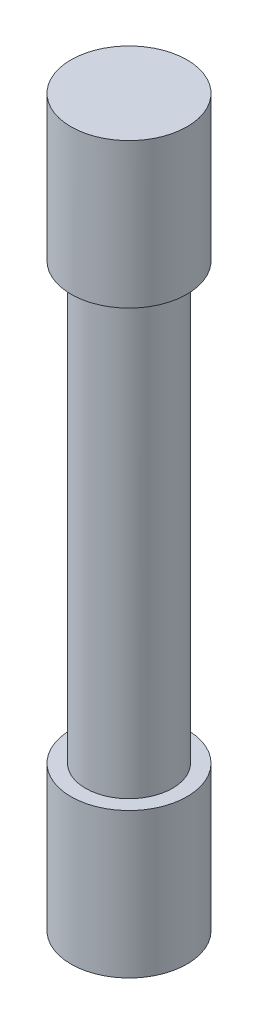
ISO-10303-21;
HEADER;
FILE_DESCRIPTION(('STEP AP214'),'2;1');
FILE_NAME('part.step','',(''),(''),'','','');
FILE_SCHEMA(('AUTOMOTIVE_DESIGN { 1 0 10303 214 1 1 1 1 }'));
ENDSEC;
DATA;
#1=APPLICATION_CONTEXT('core data for automotive mechanical design processes');
#2=APPLICATION_PROTOCOL_DEFINITION('international standard','automotive_design',2000,#1);
#3=PRODUCT_CONTEXT('',#1,'mechanical');
#4=PRODUCT('Part','Part','',(#3));
#5=PRODUCT_RELATED_PRODUCT_CATEGORY('part','',(#4));
#6=PRODUCT_DEFINITION_FORMATION('','',#4);
#7=PRODUCT_DEFINITION_CONTEXT('part definition',#1,'design');
#8=PRODUCT_DEFINITION('design','',#6,#7);
#9=PRODUCT_DEFINITION_SHAPE('','',#8);
#10=(LENGTH_UNIT() NAMED_UNIT(*) SI_UNIT(.MILLI.,.METRE.));
#11=(NAMED_UNIT(*) PLANE_ANGLE_UNIT() SI_UNIT($,.RADIAN.));
#12=(NAMED_UNIT(*) SI_UNIT($,.STERADIAN.) SOLID_ANGLE_UNIT());
#13=UNCERTAINTY_MEASURE_WITH_UNIT(LENGTH_MEASURE(1.E-05),#10,'distance_accuracy_value','');
#14=(GEOMETRIC_REPRESENTATION_CONTEXT(3) GLOBAL_UNCERTAINTY_ASSIGNED_CONTEXT((#13)) GLOBAL_UNIT_ASSIGNED_CONTEXT((#10,
#11,#12)) REPRESENTATION_CONTEXT('',''));
#15=CARTESIAN_POINT('',(0.,0.,0.));
#16=DIRECTION('',(0.,0.,1.));
#17=DIRECTION('',(1.,0.,0.));
#18=AXIS2_PLACEMENT_3D('',#15,#16,#17);
#19=CARTESIAN_POINT('',(0.,50.,0.));
#20=DIRECTION('',(0.,-1.,0.));
#21=DIRECTION('',(0.,0.,-1.));
#22=AXIS2_PLACEMENT_3D('',#19,#20,#21);
#23=CYLINDRICAL_SURFACE('',#22,4.);
#24=CARTESIAN_POINT('',(0.,0.,0.));
#25=DIRECTION('',(0.,1.,0.));
#26=DIRECTION('',(0.,0.,1.));
#27=AXIS2_PLACEMENT_3D('',#24,#25,#26);
#28=CIRCLE('',#27,4.);
#29=CARTESIAN_POINT('',(0.,0.,4.));
#30=VERTEX_POINT('',#29);
#31=EDGE_CURVE('E54',#30,#30,#28,.T.);
#32=ORIENTED_EDGE('',*,*,#31,.T.);
#33=EDGE_LOOP('',(#32));
#34=FACE_BOUND('',#33,.T.);
#35=CARTESIAN_POINT('',(0.,10.,0.));
#36=DIRECTION('',(0.,1.,0.));
#37=DIRECTION('',(0.,0.,1.));
#38=AXIS2_PLACEMENT_3D('',#35,#36,#37);
#39=CIRCLE('',#38,4.);
#40=CARTESIAN_POINT('',(0.,10.,4.));
#41=VERTEX_POINT('',#40);
#42=EDGE_CURVE('E49',#41,#41,#39,.T.);
#43=ORIENTED_EDGE('',*,*,#42,.F.);
#44=EDGE_LOOP('',(#43));
#45=FACE_BOUND('',#44,.T.);
#46=ADVANCED_FACE('F45',(#34,#45),#23,.T.);
#47=CARTESIAN_POINT('',(0.,0.,0.));
#48=DIRECTION('',(0.,1.,0.));
#49=DIRECTION('',(0.,0.,1.));
#50=AXIS2_PLACEMENT_3D('',#47,#48,#49);
#51=PLANE('',#50);
#52=ORIENTED_EDGE('',*,*,#31,.F.);
#53=EDGE_LOOP('',(#52));
#54=FACE_BOUND('',#53,.T.);
#55=ADVANCED_FACE('F92',(#54),#51,.F.);
#56=CARTESIAN_POINT('',(0.,10.,0.));
#57=DIRECTION('',(0.,1.,0.));
#58=DIRECTION('',(0.,0.,1.));
#59=AXIS2_PLACEMENT_3D('',#56,#57,#58);
#60=PLANE('',#59);
#61=CARTESIAN_POINT('',(0.,10.,0.));
#62=DIRECTION('',(0.,1.,0.));
#63=DIRECTION('',(0.,0.,1.));
#64=AXIS2_PLACEMENT_3D('',#61,#62,#63);
#65=CIRCLE('',#64,3.);
#66=CARTESIAN_POINT('',(0.,10.,3.));
#67=VERTEX_POINT('',#66);
#68=EDGE_CURVE('E63',#67,#67,#65,.T.);
#69=ORIENTED_EDGE('',*,*,#68,.F.);
#70=EDGE_LOOP('',(#69));
#71=FACE_BOUND('',#70,.T.);
#72=ORIENTED_EDGE('',*,*,#42,.T.);
#73=EDGE_LOOP('',(#72));
#74=FACE_BOUND('',#73,.T.);
#75=ADVANCED_FACE('F96',(#71,#74),#60,.T.);
#76=CARTESIAN_POINT('',(0.,10.,0.));
#77=DIRECTION('',(0.,1.,0.));
#78=DIRECTION('',(0.,0.,1.));
#79=AXIS2_PLACEMENT_3D('',#76,#77,#78);
#80=CYLINDRICAL_SURFACE('',#79,3.);
#81=ORIENTED_EDGE('',*,*,#68,.T.);
#82=EDGE_LOOP('',(#81));
#83=FACE_BOUND('',#82,.T.);
#84=CARTESIAN_POINT('',(0.,40.,0.));
#85=DIRECTION('',(0.,-1.,0.));
#86=DIRECTION('',(0.,0.,-1.));
#87=AXIS2_PLACEMENT_3D('',#84,#85,#86);
#88=CIRCLE('',#87,3.);
#89=CARTESIAN_POINT('',(0.,40.,-3.));
#90=VERTEX_POINT('',#89);
#91=EDGE_CURVE('E71',#90,#90,#88,.T.);
#92=ORIENTED_EDGE('',*,*,#91,.T.);
#93=EDGE_LOOP('',(#92));
#94=FACE_BOUND('',#93,.T.);
#95=ADVANCED_FACE('F77',(#83,#94),#80,.T.);
#96=CARTESIAN_POINT('',(0.,40.,0.));
#97=DIRECTION('',(0.,-1.,0.));
#98=DIRECTION('',(0.,0.,-1.));
#99=AXIS2_PLACEMENT_3D('',#96,#97,#98);
#100=PLANE('',#99);
#101=ORIENTED_EDGE('',*,*,#91,.F.);
#102=EDGE_LOOP('',(#101));
#103=FACE_BOUND('',#102,.T.);
#104=CARTESIAN_POINT('',(0.,40.,0.));
#105=DIRECTION('',(0.,-1.,0.));
#106=DIRECTION('',(0.,0.,-1.));
#107=AXIS2_PLACEMENT_3D('',#104,#105,#106);
#108=CIRCLE('',#107,4.);
#109=CARTESIAN_POINT('',(0.,40.,-4.));
#110=VERTEX_POINT('',#109);
#111=EDGE_CURVE('E67',#110,#110,#108,.T.);
#112=ORIENTED_EDGE('',*,*,#111,.T.);
#113=EDGE_LOOP('',(#112));
#114=FACE_BOUND('',#113,.T.);
#115=ADVANCED_FACE('F79',(#103,#114),#100,.T.);
#116=CARTESIAN_POINT('',(0.,50.,0.));
#117=DIRECTION('',(0.,1.,0.));
#118=DIRECTION('',(0.,0.,1.));
#119=AXIS2_PLACEMENT_3D('',#116,#117,#118);
#120=PLANE('',#119);
#121=CARTESIAN_POINT('',(0.,50.,0.));
#122=DIRECTION('',(0.,1.,0.));
#123=DIRECTION('',(0.,0.,1.));
#124=AXIS2_PLACEMENT_3D('',#121,#122,#123);
#125=CIRCLE('',#124,4.);
#126=CARTESIAN_POINT('',(0.,50.,4.));
#127=VERTEX_POINT('',#126);
#128=EDGE_CURVE('E10',#127,#127,#125,.T.);
#129=ORIENTED_EDGE('',*,*,#128,.T.);
#130=EDGE_LOOP('',(#129));
#131=FACE_BOUND('',#130,.T.);
#132=ADVANCED_FACE('F82',(#131),#120,.T.);
#133=ORIENTED_EDGE('',*,*,#128,.F.);
#134=EDGE_LOOP('',(#133));
#135=FACE_BOUND('',#134,.T.);
#136=ORIENTED_EDGE('',*,*,#111,.F.);
#137=EDGE_LOOP('',(#136));
#138=FACE_BOUND('',#137,.T.);
#139=ADVANCED_FACE('F47',(#135,#138),#23,.T.);
#140=CLOSED_SHELL('',(#46,#55,#75,#95,#115,#132,#139));
#141=MANIFOLD_SOLID_BREP('B2',#140);
#142=ADVANCED_BREP_SHAPE_REPRESENTATION('',(#18,#141),#14);
#143=SHAPE_DEFINITION_REPRESENTATION(#9,#142);
ENDSEC;
END-ISO-10303-21;
